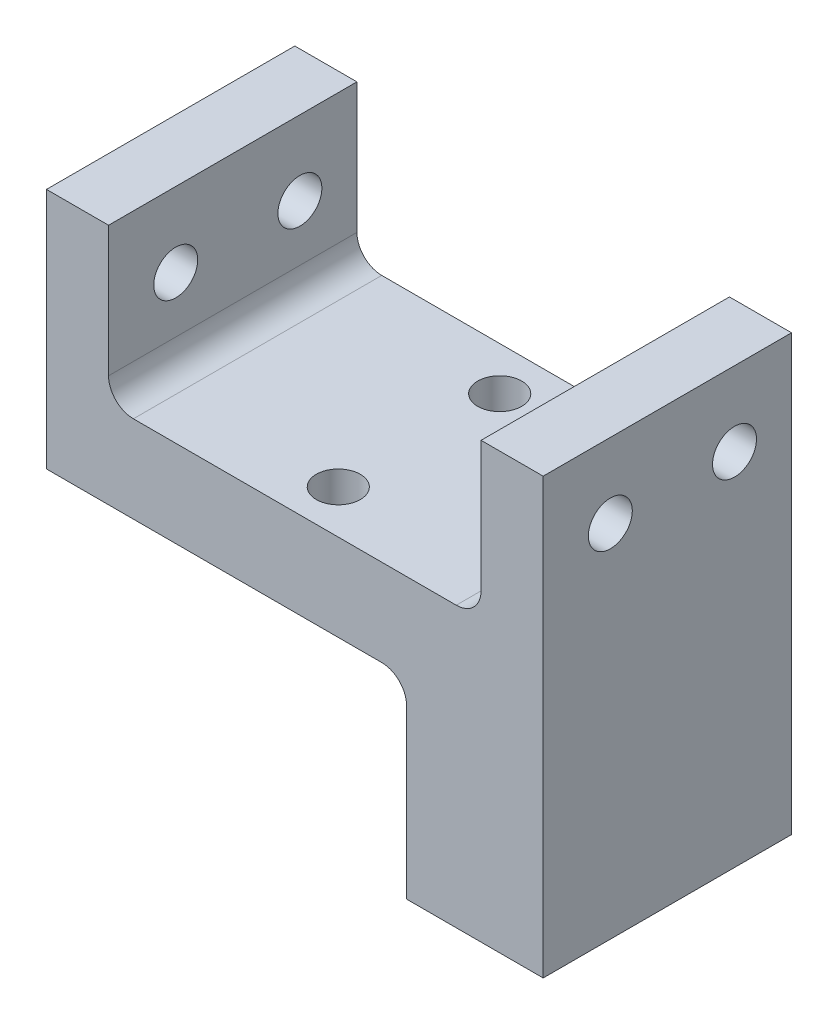
ISO-10303-21;
HEADER;
FILE_DESCRIPTION(('STEP AP214'),'2;1');
FILE_NAME('part.step','',(''),(''),'','','');
FILE_SCHEMA(('AUTOMOTIVE_DESIGN { 1 0 10303 214 1 1 1 1 }'));
ENDSEC;
DATA;
#1=APPLICATION_CONTEXT('core data for automotive mechanical design processes');
#2=APPLICATION_PROTOCOL_DEFINITION('international standard','automotive_design',2000,#1);
#3=PRODUCT_CONTEXT('',#1,'mechanical');
#4=PRODUCT('Part','Part','',(#3));
#5=PRODUCT_RELATED_PRODUCT_CATEGORY('part','',(#4));
#6=PRODUCT_DEFINITION_FORMATION('','',#4);
#7=PRODUCT_DEFINITION_CONTEXT('part definition',#1,'design');
#8=PRODUCT_DEFINITION('design','',#6,#7);
#9=PRODUCT_DEFINITION_SHAPE('','',#8);
#10=(LENGTH_UNIT() NAMED_UNIT(*) SI_UNIT(.MILLI.,.METRE.));
#11=(NAMED_UNIT(*) PLANE_ANGLE_UNIT() SI_UNIT($,.RADIAN.));
#12=(NAMED_UNIT(*) SI_UNIT($,.STERADIAN.) SOLID_ANGLE_UNIT());
#13=UNCERTAINTY_MEASURE_WITH_UNIT(LENGTH_MEASURE(1.E-05),#10,'distance_accuracy_value','');
#14=(GEOMETRIC_REPRESENTATION_CONTEXT(3) GLOBAL_UNCERTAINTY_ASSIGNED_CONTEXT((#13)) GLOBAL_UNIT_ASSIGNED_CONTEXT((#10,
#11,#12)) REPRESENTATION_CONTEXT('',''));
#15=CARTESIAN_POINT('',(0.,0.,0.));
#16=DIRECTION('',(0.,0.,1.));
#17=DIRECTION('',(1.,0.,0.));
#18=AXIS2_PLACEMENT_3D('',#15,#16,#17);
#19=CARTESIAN_POINT('',(-25.4,44.45,-12.7));
#20=DIRECTION('',(0.,0.,1.));
#21=DIRECTION('',(1.,0.,0.));
#22=AXIS2_PLACEMENT_3D('',#19,#20,#21);
#23=PLANE('',#22);
#24=CARTESIAN_POINT('',(-22.225,27.5085012840566,-12.7));
#25=DIRECTION('',(0.,0.,1.));
#26=DIRECTION('',(1.,0.,0.));
#27=AXIS2_PLACEMENT_3D('',#24,#25,#26);
#28=CIRCLE('',#27,1.27);
#29=CARTESIAN_POINT('',(-20.955,27.5085012840566,-12.7));
#30=VERTEX_POINT('',#29);
#31=EDGE_CURVE('E487',#30,#30,#28,.T.);
#32=ORIENTED_EDGE('',*,*,#31,.T.);
#33=EDGE_LOOP('',(#32));
#34=FACE_BOUND('',#33,.T.);
#35=CARTESIAN_POINT('',(22.225,27.5085012840566,-12.7));
#36=DIRECTION('',(0.,0.,1.));
#37=DIRECTION('',(1.,0.,0.));
#38=AXIS2_PLACEMENT_3D('',#35,#36,#37);
#39=CIRCLE('',#38,1.27);
#40=CARTESIAN_POINT('',(23.495,27.5085012840566,-12.7));
#41=VERTEX_POINT('',#40);
#42=EDGE_CURVE('E490',#41,#41,#39,.T.);
#43=ORIENTED_EDGE('',*,*,#42,.T.);
#44=EDGE_LOOP('',(#43));
#45=FACE_BOUND('',#44,.T.);
#46=DIRECTION('',(0.,1.,0.));
#47=VECTOR('',#46,1.);
#48=CARTESIAN_POINT('',(11.43,0.,-12.7));
#49=LINE('',#48,#47);
#50=CARTESIAN_POINT('',(11.43,0.,-12.7));
#51=VERTEX_POINT('',#50);
#52=CARTESIAN_POINT('',(11.43,17.145,-12.7));
#53=VERTEX_POINT('',#52);
#54=EDGE_CURVE('E203',#51,#53,#49,.T.);
#55=ORIENTED_EDGE('',*,*,#54,.T.);
#56=CARTESIAN_POINT('',(8.89,17.145,-12.7));
#57=DIRECTION('',(0.,0.,1.));
#58=DIRECTION('',(1.,0.,0.));
#59=AXIS2_PLACEMENT_3D('',#56,#57,#58);
#60=CIRCLE('',#59,2.54);
#61=CARTESIAN_POINT('',(8.89,19.685,-12.7));
#62=VERTEX_POINT('',#61);
#63=EDGE_CURVE('E323',#53,#62,#60,.T.);
#64=ORIENTED_EDGE('',*,*,#63,.T.);
#65=DIRECTION('',(-1.,0.,0.));
#66=VECTOR('',#65,1.);
#67=CARTESIAN_POINT('',(0.,19.685,-12.7));
#68=LINE('',#67,#66);
#69=CARTESIAN_POINT('',(-25.4,19.685,-12.7));
#70=VERTEX_POINT('',#69);
#71=EDGE_CURVE('E207',#62,#70,#68,.T.);
#72=ORIENTED_EDGE('',*,*,#71,.T.);
#73=DIRECTION('',(0.,-1.,0.));
#74=VECTOR('',#73,1.);
#75=CARTESIAN_POINT('',(-25.4,44.45,-12.7));
#76=LINE('',#75,#74);
#77=CARTESIAN_POINT('',(-25.4,44.45,-12.7));
#78=VERTEX_POINT('',#77);
#79=EDGE_CURVE('E286',#78,#70,#76,.T.);
#80=ORIENTED_EDGE('',*,*,#79,.F.);
#81=DIRECTION('',(-1.,0.,0.));
#82=VECTOR('',#81,1.);
#83=CARTESIAN_POINT('',(-25.4,44.45,-12.7));
#84=LINE('',#83,#82);
#85=CARTESIAN_POINT('',(-19.05,44.45,-12.7));
#86=VERTEX_POINT('',#85);
#87=EDGE_CURVE('E255',#86,#78,#84,.T.);
#88=ORIENTED_EDGE('',*,*,#87,.F.);
#89=DIRECTION('',(0.,1.,0.));
#90=VECTOR('',#89,1.);
#91=CARTESIAN_POINT('',(-19.05,0.,-12.7));
#92=LINE('',#91,#90);
#93=CARTESIAN_POINT('',(-19.05,31.115,-12.7));
#94=VERTEX_POINT('',#93);
#95=EDGE_CURVE('E233',#94,#86,#92,.T.);
#96=ORIENTED_EDGE('',*,*,#95,.F.);
#97=CARTESIAN_POINT('',(-16.51,31.115,-12.7));
#98=DIRECTION('',(0.,0.,1.));
#99=DIRECTION('',(1.,0.,0.));
#100=AXIS2_PLACEMENT_3D('',#97,#98,#99);
#101=CIRCLE('',#100,2.54);
#102=CARTESIAN_POINT('',(-16.51,28.575,-12.7));
#103=VERTEX_POINT('',#102);
#104=EDGE_CURVE('E329',#94,#103,#101,.T.);
#105=ORIENTED_EDGE('',*,*,#104,.T.);
#106=DIRECTION('',(1.,0.,0.));
#107=VECTOR('',#106,1.);
#108=CARTESIAN_POINT('',(0.,28.575,-12.7));
#109=LINE('',#108,#107);
#110=CARTESIAN_POINT('',(16.51,28.575,-12.7));
#111=VERTEX_POINT('',#110);
#112=EDGE_CURVE('E226',#103,#111,#109,.T.);
#113=ORIENTED_EDGE('',*,*,#112,.T.);
#114=CARTESIAN_POINT('',(16.51,31.115,-12.7));
#115=DIRECTION('',(0.,0.,1.));
#116=DIRECTION('',(1.,0.,0.));
#117=AXIS2_PLACEMENT_3D('',#114,#115,#116);
#118=CIRCLE('',#117,2.54);
#119=CARTESIAN_POINT('',(19.05,31.115,-12.7));
#120=VERTEX_POINT('',#119);
#121=EDGE_CURVE('E11',#111,#120,#118,.T.);
#122=ORIENTED_EDGE('',*,*,#121,.T.);
#123=DIRECTION('',(0.,1.,0.));
#124=VECTOR('',#123,1.);
#125=CARTESIAN_POINT('',(19.05,0.,-12.7));
#126=LINE('',#125,#124);
#127=CARTESIAN_POINT('',(19.05,44.45,-12.7));
#128=VERTEX_POINT('',#127);
#129=EDGE_CURVE('E229',#120,#128,#126,.T.);
#130=ORIENTED_EDGE('',*,*,#129,.T.);
#131=CARTESIAN_POINT('',(25.4,44.45,-12.7));
#132=VERTEX_POINT('',#131);
#133=EDGE_CURVE('E257',#132,#128,#84,.T.);
#134=ORIENTED_EDGE('',*,*,#133,.F.);
#135=DIRECTION('',(0.,-1.,0.));
#136=VECTOR('',#135,1.);
#137=CARTESIAN_POINT('',(25.4,44.45,-12.7));
#138=LINE('',#137,#136);
#139=CARTESIAN_POINT('',(25.4,0.,-12.7));
#140=VERTEX_POINT('',#139);
#141=EDGE_CURVE('E290',#132,#140,#138,.T.);
#142=ORIENTED_EDGE('',*,*,#141,.T.);
#143=DIRECTION('',(-1.,0.,0.));
#144=VECTOR('',#143,1.);
#145=CARTESIAN_POINT('',(-25.4,0.,-12.7));
#146=LINE('',#145,#144);
#147=EDGE_CURVE('E273',#140,#51,#146,.T.);
#148=ORIENTED_EDGE('',*,*,#147,.T.);
#149=EDGE_LOOP('',(#55,#64,#72,#80,#88,#96,#105,#113,#122,#130,#134,#142,#148));
#150=FACE_BOUND('',#149,.T.);
#151=ADVANCED_FACE('F45',(#34,#45,#150),#23,.F.);
#152=CARTESIAN_POINT('',(-25.4,44.45,12.7));
#153=DIRECTION('',(0.,0.,-1.));
#154=DIRECTION('',(-1.,0.,0.));
#155=AXIS2_PLACEMENT_3D('',#152,#153,#154);
#156=PLANE('',#155);
#157=DIRECTION('',(0.,-1.,0.));
#158=VECTOR('',#157,1.);
#159=CARTESIAN_POINT('',(-25.4,44.45,12.7));
#160=LINE('',#159,#158);
#161=CARTESIAN_POINT('',(-25.4,44.45,12.7));
#162=VERTEX_POINT('',#161);
#163=CARTESIAN_POINT('',(-25.4,19.685,12.7));
#164=VERTEX_POINT('',#163);
#165=EDGE_CURVE('E282',#162,#164,#160,.T.);
#166=ORIENTED_EDGE('',*,*,#165,.T.);
#167=DIRECTION('',(-1.,0.,0.));
#168=VECTOR('',#167,1.);
#169=CARTESIAN_POINT('',(0.,19.685,12.7));
#170=LINE('',#169,#168);
#171=CARTESIAN_POINT('',(8.89,19.685,12.7));
#172=VERTEX_POINT('',#171);
#173=EDGE_CURVE('E208',#172,#164,#170,.T.);
#174=ORIENTED_EDGE('',*,*,#173,.F.);
#175=CARTESIAN_POINT('',(8.89,17.145,12.7));
#176=DIRECTION('',(0.,0.,-1.));
#177=DIRECTION('',(-1.,0.,0.));
#178=AXIS2_PLACEMENT_3D('',#175,#176,#177);
#179=CIRCLE('',#178,2.54);
#180=CARTESIAN_POINT('',(11.43,17.145,12.7));
#181=VERTEX_POINT('',#180);
#182=EDGE_CURVE('E320',#172,#181,#179,.T.);
#183=ORIENTED_EDGE('',*,*,#182,.T.);
#184=DIRECTION('',(0.,1.,0.));
#185=VECTOR('',#184,1.);
#186=CARTESIAN_POINT('',(11.43,0.,12.7));
#187=LINE('',#186,#185);
#188=CARTESIAN_POINT('',(11.43,0.,12.7));
#189=VERTEX_POINT('',#188);
#190=EDGE_CURVE('E212',#189,#181,#187,.T.);
#191=ORIENTED_EDGE('',*,*,#190,.F.);
#192=DIRECTION('',(1.,0.,0.));
#193=VECTOR('',#192,1.);
#194=CARTESIAN_POINT('',(-25.4,0.,12.7));
#195=LINE('',#194,#193);
#196=CARTESIAN_POINT('',(25.4,0.,12.7));
#197=VERTEX_POINT('',#196);
#198=EDGE_CURVE('E256',#189,#197,#195,.T.);
#199=ORIENTED_EDGE('',*,*,#198,.T.);
#200=DIRECTION('',(0.,-1.,0.));
#201=VECTOR('',#200,1.);
#202=CARTESIAN_POINT('',(25.4,44.45,12.7));
#203=LINE('',#202,#201);
#204=CARTESIAN_POINT('',(25.4,44.45,12.7));
#205=VERTEX_POINT('',#204);
#206=EDGE_CURVE('E269',#205,#197,#203,.T.);
#207=ORIENTED_EDGE('',*,*,#206,.F.);
#208=DIRECTION('',(1.,0.,0.));
#209=VECTOR('',#208,1.);
#210=CARTESIAN_POINT('',(-25.4,44.45,12.7));
#211=LINE('',#210,#209);
#212=CARTESIAN_POINT('',(19.05,44.45,12.7));
#213=VERTEX_POINT('',#212);
#214=EDGE_CURVE('E264',#213,#205,#211,.T.);
#215=ORIENTED_EDGE('',*,*,#214,.F.);
#216=DIRECTION('',(0.,1.,0.));
#217=VECTOR('',#216,1.);
#218=CARTESIAN_POINT('',(19.05,0.,12.7));
#219=LINE('',#218,#217);
#220=CARTESIAN_POINT('',(19.05,31.115,12.7));
#221=VERTEX_POINT('',#220);
#222=EDGE_CURVE('E240',#221,#213,#219,.T.);
#223=ORIENTED_EDGE('',*,*,#222,.F.);
#224=CARTESIAN_POINT('',(16.51,31.115,12.7));
#225=DIRECTION('',(0.,0.,-1.));
#226=DIRECTION('',(-1.,0.,0.));
#227=AXIS2_PLACEMENT_3D('',#224,#225,#226);
#228=CIRCLE('',#227,2.54);
#229=CARTESIAN_POINT('',(16.51,28.575,12.7));
#230=VERTEX_POINT('',#229);
#231=EDGE_CURVE('E54',#221,#230,#228,.T.);
#232=ORIENTED_EDGE('',*,*,#231,.T.);
#233=DIRECTION('',(1.,0.,0.));
#234=VECTOR('',#233,1.);
#235=CARTESIAN_POINT('',(0.,28.575,12.7));
#236=LINE('',#235,#234);
#237=CARTESIAN_POINT('',(-16.51,28.575,12.7));
#238=VERTEX_POINT('',#237);
#239=EDGE_CURVE('E202',#238,#230,#236,.T.);
#240=ORIENTED_EDGE('',*,*,#239,.F.);
#241=CARTESIAN_POINT('',(-16.51,31.115,12.7));
#242=DIRECTION('',(0.,0.,-1.));
#243=DIRECTION('',(-1.,0.,0.));
#244=AXIS2_PLACEMENT_3D('',#241,#242,#243);
#245=CIRCLE('',#244,2.54);
#246=CARTESIAN_POINT('',(-19.05,31.115,12.7));
#247=VERTEX_POINT('',#246);
#248=EDGE_CURVE('E326',#238,#247,#245,.T.);
#249=ORIENTED_EDGE('',*,*,#248,.T.);
#250=DIRECTION('',(0.,1.,0.));
#251=VECTOR('',#250,1.);
#252=CARTESIAN_POINT('',(-19.05,0.,12.7));
#253=LINE('',#252,#251);
#254=CARTESIAN_POINT('',(-19.05,44.45,12.7));
#255=VERTEX_POINT('',#254);
#256=EDGE_CURVE('E230',#247,#255,#253,.T.);
#257=ORIENTED_EDGE('',*,*,#256,.T.);
#258=EDGE_CURVE('E265',#162,#255,#211,.T.);
#259=ORIENTED_EDGE('',*,*,#258,.F.);
#260=EDGE_LOOP('',(#166,#174,#183,#191,#199,#207,#215,#223,#232,#240,#249,#257,#259));
#261=FACE_BOUND('',#260,.T.);
#262=ADVANCED_FACE('F335',(#261),#156,.F.);
#263=CARTESIAN_POINT('',(0.,44.45,0.));
#264=DIRECTION('',(0.,-1.,0.));
#265=DIRECTION('',(0.,0.,-1.));
#266=AXIS2_PLACEMENT_3D('',#263,#264,#265);
#267=PLANE('',#266);
#268=DIRECTION('',(0.,0.,1.));
#269=VECTOR('',#268,1.);
#270=CARTESIAN_POINT('',(-19.05,44.45,-12.7));
#271=LINE('',#270,#269);
#272=EDGE_CURVE('E216',#86,#255,#271,.T.);
#273=ORIENTED_EDGE('',*,*,#272,.F.);
#274=ORIENTED_EDGE('',*,*,#87,.T.);
#275=DIRECTION('',(0.,0.,1.));
#276=VECTOR('',#275,1.);
#277=CARTESIAN_POINT('',(-25.4,44.45,12.7));
#278=LINE('',#277,#276);
#279=EDGE_CURVE('E261',#78,#162,#278,.T.);
#280=ORIENTED_EDGE('',*,*,#279,.T.);
#281=ORIENTED_EDGE('',*,*,#258,.T.);
#282=EDGE_LOOP('',(#273,#274,#280,#281));
#283=FACE_BOUND('',#282,.T.);
#284=ADVANCED_FACE('F381',(#283),#267,.F.);
#285=CARTESIAN_POINT('',(25.4,44.45,12.7));
#286=DIRECTION('',(-1.,0.,0.));
#287=DIRECTION('',(0.,0.,1.));
#288=AXIS2_PLACEMENT_3D('',#285,#286,#287);
#289=PLANE('',#288);
#290=CARTESIAN_POINT('',(25.4,36.83,-6.86818594327573));
#291=DIRECTION('',(1.,0.,0.));
#292=DIRECTION('',(0.,0.,-1.));
#293=AXIS2_PLACEMENT_3D('',#290,#291,#292);
#294=CIRCLE('',#293,2.24789999999999);
#295=CARTESIAN_POINT('',(25.4,36.83,-9.11608594327572));
#296=VERTEX_POINT('',#295);
#297=EDGE_CURVE('E173',#296,#296,#294,.T.);
#298=ORIENTED_EDGE('',*,*,#297,.F.);
#299=EDGE_LOOP('',(#298));
#300=FACE_BOUND('',#299,.T.);
#301=CARTESIAN_POINT('',(25.4,36.83,5.83181405672426));
#302=DIRECTION('',(1.,0.,0.));
#303=DIRECTION('',(0.,0.,-1.));
#304=AXIS2_PLACEMENT_3D('',#301,#302,#303);
#305=CIRCLE('',#304,2.24789999999999);
#306=CARTESIAN_POINT('',(25.4,36.83,3.58391405672428));
#307=VERTEX_POINT('',#306);
#308=EDGE_CURVE('E186',#307,#307,#305,.T.);
#309=ORIENTED_EDGE('',*,*,#308,.F.);
#310=EDGE_LOOP('',(#309));
#311=FACE_BOUND('',#310,.T.);
#312=DIRECTION('',(0.,0.,-1.));
#313=VECTOR('',#312,1.);
#314=CARTESIAN_POINT('',(25.4,0.,12.7));
#315=LINE('',#314,#313);
#316=EDGE_CURVE('E223',#197,#140,#315,.T.);
#317=ORIENTED_EDGE('',*,*,#316,.T.);
#318=ORIENTED_EDGE('',*,*,#141,.F.);
#319=DIRECTION('',(0.,0.,-1.));
#320=VECTOR('',#319,1.);
#321=CARTESIAN_POINT('',(25.4,44.45,12.7));
#322=LINE('',#321,#320);
#323=EDGE_CURVE('E251',#205,#132,#322,.T.);
#324=ORIENTED_EDGE('',*,*,#323,.F.);
#325=ORIENTED_EDGE('',*,*,#206,.T.);
#326=EDGE_LOOP('',(#317,#318,#324,#325));
#327=FACE_BOUND('',#326,.T.);
#328=ADVANCED_FACE('F350',(#300,#311,#327),#289,.F.);
#329=CARTESIAN_POINT('',(-25.4,44.45,12.7));
#330=DIRECTION('',(1.,0.,0.));
#331=DIRECTION('',(0.,0.,-1.));
#332=AXIS2_PLACEMENT_3D('',#329,#330,#331);
#333=PLANE('',#332);
#334=CARTESIAN_POINT('',(-25.4,36.83,-6.86818594327573));
#335=DIRECTION('',(1.,0.,0.));
#336=DIRECTION('',(0.,0.,-1.));
#337=AXIS2_PLACEMENT_3D('',#334,#335,#336);
#338=CIRCLE('',#337,2.24789999999999);
#339=CARTESIAN_POINT('',(-25.4,36.83,-9.11608594327572));
#340=VERTEX_POINT('',#339);
#341=EDGE_CURVE('E177',#340,#340,#338,.T.);
#342=ORIENTED_EDGE('',*,*,#341,.T.);
#343=EDGE_LOOP('',(#342));
#344=FACE_BOUND('',#343,.T.);
#345=CARTESIAN_POINT('',(-25.4,36.83,5.83181405672426));
#346=DIRECTION('',(1.,0.,0.));
#347=DIRECTION('',(0.,0.,-1.));
#348=AXIS2_PLACEMENT_3D('',#345,#346,#347);
#349=CIRCLE('',#348,2.24789999999999);
#350=CARTESIAN_POINT('',(-25.4,36.83,3.58391405672428));
#351=VERTEX_POINT('',#350);
#352=EDGE_CURVE('E190',#351,#351,#349,.T.);
#353=ORIENTED_EDGE('',*,*,#352,.T.);
#354=EDGE_LOOP('',(#353));
#355=FACE_BOUND('',#354,.T.);
#356=ORIENTED_EDGE('',*,*,#79,.T.);
#357=DIRECTION('',(0.,0.,1.));
#358=VECTOR('',#357,1.);
#359=CARTESIAN_POINT('',(-25.4,19.685,-12.7));
#360=LINE('',#359,#358);
#361=EDGE_CURVE('E219',#70,#164,#360,.T.);
#362=ORIENTED_EDGE('',*,*,#361,.T.);
#363=ORIENTED_EDGE('',*,*,#165,.F.);
#364=ORIENTED_EDGE('',*,*,#279,.F.);
#365=EDGE_LOOP('',(#356,#362,#363,#364));
#366=FACE_BOUND('',#365,.T.);
#367=ADVANCED_FACE('F372',(#344,#355,#366),#333,.F.);
#368=ORIENTED_EDGE('',*,*,#133,.T.);
#369=DIRECTION('',(0.,0.,1.));
#370=VECTOR('',#369,1.);
#371=CARTESIAN_POINT('',(19.05,44.45,-12.7));
#372=LINE('',#371,#370);
#373=EDGE_CURVE('E236',#128,#213,#372,.T.);
#374=ORIENTED_EDGE('',*,*,#373,.T.);
#375=ORIENTED_EDGE('',*,*,#214,.T.);
#376=ORIENTED_EDGE('',*,*,#323,.T.);
#377=EDGE_LOOP('',(#368,#374,#375,#376));
#378=FACE_BOUND('',#377,.T.);
#379=ADVANCED_FACE('F347',(#378),#267,.F.);
#380=CARTESIAN_POINT('',(0.,0.,0.));
#381=DIRECTION('',(0.,-1.,0.));
#382=DIRECTION('',(0.,0.,-1.));
#383=AXIS2_PLACEMENT_3D('',#380,#381,#382);
#384=PLANE('',#383);
#385=DIRECTION('',(0.,0.,1.));
#386=VECTOR('',#385,1.);
#387=CARTESIAN_POINT('',(11.43,0.,-12.7));
#388=LINE('',#387,#386);
#389=EDGE_CURVE('E211',#51,#189,#388,.T.);
#390=ORIENTED_EDGE('',*,*,#389,.F.);
#391=ORIENTED_EDGE('',*,*,#147,.F.);
#392=ORIENTED_EDGE('',*,*,#316,.F.);
#393=ORIENTED_EDGE('',*,*,#198,.F.);
#394=EDGE_LOOP('',(#390,#391,#392,#393));
#395=FACE_BOUND('',#394,.T.);
#396=ADVANCED_FACE('F355',(#395),#384,.T.);
#397=CARTESIAN_POINT('',(0.,19.685,-12.7));
#398=DIRECTION('',(0.,1.,0.));
#399=DIRECTION('',(-1.,0.,0.));
#400=AXIS2_PLACEMENT_3D('',#397,#398,#399);
#401=PLANE('',#400);
#402=CARTESIAN_POINT('',(0.,19.685,-8.255));
#403=DIRECTION('',(0.,1.,0.));
#404=DIRECTION('',(-1.,0.,0.));
#405=AXIS2_PLACEMENT_3D('',#402,#403,#404);
#406=CIRCLE('',#405,2.24789999999999);
#407=CARTESIAN_POINT('',(-2.24789999999999,19.685,-8.255));
#408=VERTEX_POINT('',#407);
#409=EDGE_CURVE('E158',#408,#408,#406,.T.);
#410=ORIENTED_EDGE('',*,*,#409,.T.);
#411=EDGE_LOOP('',(#410));
#412=FACE_BOUND('',#411,.T.);
#413=CARTESIAN_POINT('',(0.,19.685,8.255));
#414=DIRECTION('',(0.,1.,0.));
#415=DIRECTION('',(-1.,0.,0.));
#416=AXIS2_PLACEMENT_3D('',#413,#414,#415);
#417=CIRCLE('',#416,2.24789999999999);
#418=CARTESIAN_POINT('',(-2.24789999999999,19.685,8.255));
#419=VERTEX_POINT('',#418);
#420=EDGE_CURVE('E169',#419,#419,#417,.T.);
#421=ORIENTED_EDGE('',*,*,#420,.T.);
#422=EDGE_LOOP('',(#421));
#423=FACE_BOUND('',#422,.T.);
#424=ORIENTED_EDGE('',*,*,#71,.F.);
#425=DIRECTION('',(0.,0.,1.));
#426=VECTOR('',#425,1.);
#427=CARTESIAN_POINT('',(8.89,19.685,12.7));
#428=LINE('',#427,#426);
#429=EDGE_CURVE('E294',#62,#172,#428,.T.);
#430=ORIENTED_EDGE('',*,*,#429,.T.);
#431=ORIENTED_EDGE('',*,*,#173,.T.);
#432=ORIENTED_EDGE('',*,*,#361,.F.);
#433=EDGE_LOOP('',(#424,#430,#431,#432));
#434=FACE_BOUND('',#433,.T.);
#435=ADVANCED_FACE('F365',(#412,#423,#434),#401,.F.);
#436=CARTESIAN_POINT('',(11.43,0.,-12.7));
#437=DIRECTION('',(1.,0.,0.));
#438=DIRECTION('',(0.,1.,0.));
#439=AXIS2_PLACEMENT_3D('',#436,#437,#438);
#440=PLANE('',#439);
#441=CARTESIAN_POINT('',(11.43,6.09600000000001,2.91627603880779));
#442=DIRECTION('',(-1.,0.,0.));
#443=DIRECTION('',(0.,0.,1.));
#444=AXIS2_PLACEMENT_3D('',#441,#442,#443);
#445=CIRCLE('',#444,2.28599999999999);
#446=CARTESIAN_POINT('',(11.43,6.09600000000001,5.20227603880777));
#447=VERTEX_POINT('',#446);
#448=EDGE_CURVE('E153',#447,#447,#445,.T.);
#449=ORIENTED_EDGE('',*,*,#448,.F.);
#450=EDGE_LOOP('',(#449));
#451=FACE_BOUND('',#450,.T.);
#452=ORIENTED_EDGE('',*,*,#190,.T.);
#453=DIRECTION('',(0.,0.,1.));
#454=VECTOR('',#453,1.);
#455=CARTESIAN_POINT('',(11.43,17.145,-12.7));
#456=LINE('',#455,#454);
#457=EDGE_CURVE('E304',#181,#53,#456,.F.);
#458=ORIENTED_EDGE('',*,*,#457,.T.);
#459=ORIENTED_EDGE('',*,*,#54,.F.);
#460=ORIENTED_EDGE('',*,*,#389,.T.);
#461=EDGE_LOOP('',(#452,#458,#459,#460));
#462=FACE_BOUND('',#461,.T.);
#463=ADVANCED_FACE('F441',(#451,#462),#440,.F.);
#464=CARTESIAN_POINT('',(0.,28.575,-12.7));
#465=DIRECTION('',(0.,-1.,0.));
#466=DIRECTION('',(0.,0.,-1.));
#467=AXIS2_PLACEMENT_3D('',#464,#465,#466);
#468=PLANE('',#467);
#469=CARTESIAN_POINT('',(0.,28.575,-8.255));
#470=DIRECTION('',(0.,1.,0.));
#471=DIRECTION('',(0.,0.,1.));
#472=AXIS2_PLACEMENT_3D('',#469,#470,#471);
#473=CIRCLE('',#472,2.24789999999999);
#474=CARTESIAN_POINT('',(0.,28.575,-6.00710000000001));
#475=VERTEX_POINT('',#474);
#476=EDGE_CURVE('E152',#475,#475,#473,.T.);
#477=ORIENTED_EDGE('',*,*,#476,.F.);
#478=EDGE_LOOP('',(#477));
#479=FACE_BOUND('',#478,.T.);
#480=CARTESIAN_POINT('',(0.,28.575,8.255));
#481=DIRECTION('',(0.,1.,0.));
#482=DIRECTION('',(0.,0.,1.));
#483=AXIS2_PLACEMENT_3D('',#480,#481,#482);
#484=CIRCLE('',#483,2.24789999999999);
#485=CARTESIAN_POINT('',(0.,28.575,10.5029));
#486=VERTEX_POINT('',#485);
#487=EDGE_CURVE('E165',#486,#486,#484,.T.);
#488=ORIENTED_EDGE('',*,*,#487,.F.);
#489=EDGE_LOOP('',(#488));
#490=FACE_BOUND('',#489,.T.);
#491=ORIENTED_EDGE('',*,*,#112,.F.);
#492=DIRECTION('',(0.,0.,1.));
#493=VECTOR('',#492,1.);
#494=CARTESIAN_POINT('',(-16.51,28.575,-12.7));
#495=LINE('',#494,#493);
#496=EDGE_CURVE('E310',#103,#238,#495,.T.);
#497=ORIENTED_EDGE('',*,*,#496,.T.);
#498=ORIENTED_EDGE('',*,*,#239,.T.);
#499=DIRECTION('',(0.,0.,1.));
#500=VECTOR('',#499,1.);
#501=CARTESIAN_POINT('',(16.51,28.575,-12.7));
#502=LINE('',#501,#500);
#503=EDGE_CURVE('E307',#230,#111,#502,.F.);
#504=ORIENTED_EDGE('',*,*,#503,.T.);
#505=EDGE_LOOP('',(#491,#497,#498,#504));
#506=FACE_BOUND('',#505,.T.);
#507=ADVANCED_FACE('F339',(#479,#490,#506),#468,.F.);
#508=CARTESIAN_POINT('',(-19.05,0.,-12.7));
#509=DIRECTION('',(1.,0.,0.));
#510=DIRECTION('',(0.,0.,-1.));
#511=AXIS2_PLACEMENT_3D('',#508,#509,#510);
#512=PLANE('',#511);
#513=CARTESIAN_POINT('',(-19.05,36.83,-6.86818594327573));
#514=DIRECTION('',(1.,0.,0.));
#515=DIRECTION('',(0.,0.,-1.));
#516=AXIS2_PLACEMENT_3D('',#513,#514,#515);
#517=CIRCLE('',#516,2.24789999999999);
#518=CARTESIAN_POINT('',(-19.05,36.83,-9.11608594327572));
#519=VERTEX_POINT('',#518);
#520=EDGE_CURVE('E182',#519,#519,#517,.T.);
#521=ORIENTED_EDGE('',*,*,#520,.F.);
#522=EDGE_LOOP('',(#521));
#523=FACE_BOUND('',#522,.T.);
#524=CARTESIAN_POINT('',(-19.05,36.83,5.83181405672426));
#525=DIRECTION('',(1.,0.,0.));
#526=DIRECTION('',(0.,0.,-1.));
#527=AXIS2_PLACEMENT_3D('',#524,#525,#526);
#528=CIRCLE('',#527,2.24789999999999);
#529=CARTESIAN_POINT('',(-19.05,36.83,3.58391405672428));
#530=VERTEX_POINT('',#529);
#531=EDGE_CURVE('E194',#530,#530,#528,.T.);
#532=ORIENTED_EDGE('',*,*,#531,.F.);
#533=EDGE_LOOP('',(#532));
#534=FACE_BOUND('',#533,.T.);
#535=ORIENTED_EDGE('',*,*,#256,.F.);
#536=DIRECTION('',(0.,0.,1.));
#537=VECTOR('',#536,1.);
#538=CARTESIAN_POINT('',(-19.05,31.115,-12.7));
#539=LINE('',#538,#537);
#540=EDGE_CURVE('E314',#247,#94,#539,.F.);
#541=ORIENTED_EDGE('',*,*,#540,.T.);
#542=ORIENTED_EDGE('',*,*,#95,.T.);
#543=ORIENTED_EDGE('',*,*,#272,.T.);
#544=EDGE_LOOP('',(#535,#541,#542,#543));
#545=FACE_BOUND('',#544,.T.);
#546=ADVANCED_FACE('F384',(#523,#534,#545),#512,.T.);
#547=CARTESIAN_POINT('',(19.05,0.,-12.7));
#548=DIRECTION('',(1.,0.,0.));
#549=DIRECTION('',(0.,0.,-1.));
#550=AXIS2_PLACEMENT_3D('',#547,#548,#549);
#551=PLANE('',#550);
#552=CARTESIAN_POINT('',(19.05,36.83,-6.86818594327573));
#553=DIRECTION('',(1.,0.,0.));
#554=DIRECTION('',(0.,0.,-1.));
#555=AXIS2_PLACEMENT_3D('',#552,#553,#554);
#556=CIRCLE('',#555,2.24789999999999);
#557=CARTESIAN_POINT('',(19.05,36.83,-9.11608594327572));
#558=VERTEX_POINT('',#557);
#559=EDGE_CURVE('E181',#558,#558,#556,.T.);
#560=ORIENTED_EDGE('',*,*,#559,.T.);
#561=EDGE_LOOP('',(#560));
#562=FACE_BOUND('',#561,.T.);
#563=CARTESIAN_POINT('',(19.05,36.83,5.83181405672426));
#564=DIRECTION('',(1.,0.,0.));
#565=DIRECTION('',(0.,0.,-1.));
#566=AXIS2_PLACEMENT_3D('',#563,#564,#565);
#567=CIRCLE('',#566,2.24789999999999);
#568=CARTESIAN_POINT('',(19.05,36.83,3.58391405672428));
#569=VERTEX_POINT('',#568);
#570=EDGE_CURVE('E198',#569,#569,#567,.T.);
#571=ORIENTED_EDGE('',*,*,#570,.T.);
#572=EDGE_LOOP('',(#571));
#573=FACE_BOUND('',#572,.T.);
#574=ORIENTED_EDGE('',*,*,#129,.F.);
#575=DIRECTION('',(0.,0.,1.));
#576=VECTOR('',#575,1.);
#577=CARTESIAN_POINT('',(19.05,31.115,12.7));
#578=LINE('',#577,#576);
#579=EDGE_CURVE('E317',#120,#221,#578,.T.);
#580=ORIENTED_EDGE('',*,*,#579,.T.);
#581=ORIENTED_EDGE('',*,*,#222,.T.);
#582=ORIENTED_EDGE('',*,*,#373,.F.);
#583=EDGE_LOOP('',(#574,#580,#581,#582));
#584=FACE_BOUND('',#583,.T.);
#585=ADVANCED_FACE('F342',(#562,#573,#584),#551,.F.);
#586=CARTESIAN_POINT('',(25.4,36.83,5.83181405672426));
#587=DIRECTION('',(1.,0.,0.));
#588=DIRECTION('',(0.,0.,-1.));
#589=AXIS2_PLACEMENT_3D('',#586,#587,#588);
#590=CYLINDRICAL_SURFACE('',#589,2.24789999999999);
#591=ORIENTED_EDGE('',*,*,#531,.T.);
#592=EDGE_LOOP('',(#591));
#593=FACE_BOUND('',#592,.T.);
#594=ORIENTED_EDGE('',*,*,#352,.F.);
#595=EDGE_LOOP('',(#594));
#596=FACE_BOUND('',#595,.T.);
#597=ADVANCED_FACE('F424',(#593,#596),#590,.F.);
#598=ORIENTED_EDGE('',*,*,#308,.T.);
#599=EDGE_LOOP('',(#598));
#600=FACE_BOUND('',#599,.T.);
#601=ORIENTED_EDGE('',*,*,#570,.F.);
#602=EDGE_LOOP('',(#601));
#603=FACE_BOUND('',#602,.T.);
#604=ADVANCED_FACE('F420',(#600,#603),#590,.F.);
#605=CARTESIAN_POINT('',(25.4,36.83,-6.86818594327573));
#606=DIRECTION('',(1.,0.,0.));
#607=DIRECTION('',(0.,0.,-1.));
#608=AXIS2_PLACEMENT_3D('',#605,#606,#607);
#609=CYLINDRICAL_SURFACE('',#608,2.24789999999999);
#610=ORIENTED_EDGE('',*,*,#297,.T.);
#611=EDGE_LOOP('',(#610));
#612=FACE_BOUND('',#611,.T.);
#613=ORIENTED_EDGE('',*,*,#559,.F.);
#614=EDGE_LOOP('',(#613));
#615=FACE_BOUND('',#614,.T.);
#616=ADVANCED_FACE('F423',(#612,#615),#609,.F.);
#617=ORIENTED_EDGE('',*,*,#520,.T.);
#618=EDGE_LOOP('',(#617));
#619=FACE_BOUND('',#618,.T.);
#620=ORIENTED_EDGE('',*,*,#341,.F.);
#621=EDGE_LOOP('',(#620));
#622=FACE_BOUND('',#621,.T.);
#623=ADVANCED_FACE('F456',(#619,#622),#609,.F.);
#624=CARTESIAN_POINT('',(0.,28.575,8.255));
#625=DIRECTION('',(0.,1.,0.));
#626=DIRECTION('',(0.,0.,1.));
#627=AXIS2_PLACEMENT_3D('',#624,#625,#626);
#628=CYLINDRICAL_SURFACE('',#627,2.24789999999999);
#629=ORIENTED_EDGE('',*,*,#487,.T.);
#630=EDGE_LOOP('',(#629));
#631=FACE_BOUND('',#630,.T.);
#632=ORIENTED_EDGE('',*,*,#420,.F.);
#633=EDGE_LOOP('',(#632));
#634=FACE_BOUND('',#633,.T.);
#635=ADVANCED_FACE('F459',(#631,#634),#628,.F.);
#636=CARTESIAN_POINT('',(0.,28.575,-8.255));
#637=DIRECTION('',(0.,1.,0.));
#638=DIRECTION('',(0.,0.,1.));
#639=AXIS2_PLACEMENT_3D('',#636,#637,#638);
#640=CYLINDRICAL_SURFACE('',#639,2.24789999999999);
#641=ORIENTED_EDGE('',*,*,#476,.T.);
#642=EDGE_LOOP('',(#641));
#643=FACE_BOUND('',#642,.T.);
#644=ORIENTED_EDGE('',*,*,#409,.F.);
#645=EDGE_LOOP('',(#644));
#646=FACE_BOUND('',#645,.T.);
#647=ADVANCED_FACE('F145',(#643,#646),#640,.F.);
#648=CARTESIAN_POINT('',(19.05,6.09600000000001,2.91627603880779));
#649=DIRECTION('',(-1.,0.,0.));
#650=DIRECTION('',(0.,0.,1.));
#651=AXIS2_PLACEMENT_3D('',#648,#649,#650);
#652=CONICAL_SURFACE('',#651,2.286,1.02974425867665);
#653=CARTESIAN_POINT('',(20.423567375097,6.096,2.91627603880779));
#654=VERTEX_POINT('',#653);
#655=VERTEX_LOOP('',#654);
#656=FACE_BOUND('',#655,.T.);
#657=CARTESIAN_POINT('',(19.05,6.09600000000001,2.91627603880779));
#658=DIRECTION('',(-1.,0.,0.));
#659=DIRECTION('',(0.,0.,1.));
#660=AXIS2_PLACEMENT_3D('',#657,#658,#659);
#661=CIRCLE('',#660,2.286);
#662=CARTESIAN_POINT('',(19.05,6.09600000000001,5.20227603880778));
#663=VERTEX_POINT('',#662);
#664=EDGE_CURVE('E149',#663,#663,#661,.T.);
#665=ORIENTED_EDGE('',*,*,#664,.T.);
#666=EDGE_LOOP('',(#665));
#667=FACE_BOUND('',#666,.T.);
#668=ADVANCED_FACE('F141',(#656,#667),#652,.F.);
#669=CARTESIAN_POINT('',(11.43,6.09600000000001,2.91627603880779));
#670=DIRECTION('',(-1.,0.,0.));
#671=DIRECTION('',(0.,0.,1.));
#672=AXIS2_PLACEMENT_3D('',#669,#670,#671);
#673=CYLINDRICAL_SURFACE('',#672,2.28599999999999);
#674=ORIENTED_EDGE('',*,*,#664,.F.);
#675=EDGE_LOOP('',(#674));
#676=FACE_BOUND('',#675,.T.);
#677=ORIENTED_EDGE('',*,*,#448,.T.);
#678=EDGE_LOOP('',(#677));
#679=FACE_BOUND('',#678,.T.);
#680=ADVANCED_FACE('F144',(#676,#679),#673,.F.);
#681=CARTESIAN_POINT('',(8.89,17.145,-12.7));
#682=DIRECTION('',(0.,0.,-1.));
#683=DIRECTION('',(-1.,0.,0.));
#684=AXIS2_PLACEMENT_3D('',#681,#682,#683);
#685=CYLINDRICAL_SURFACE('',#684,2.54);
#686=ORIENTED_EDGE('',*,*,#63,.F.);
#687=ORIENTED_EDGE('',*,*,#457,.F.);
#688=ORIENTED_EDGE('',*,*,#182,.F.);
#689=ORIENTED_EDGE('',*,*,#429,.F.);
#690=EDGE_LOOP('',(#686,#687,#688,#689));
#691=FACE_BOUND('',#690,.T.);
#692=ADVANCED_FACE('F362',(#691),#685,.F.);
#693=CARTESIAN_POINT('',(-16.51,31.115,-12.7));
#694=DIRECTION('',(0.,0.,1.));
#695=DIRECTION('',(1.,0.,0.));
#696=AXIS2_PLACEMENT_3D('',#693,#694,#695);
#697=CYLINDRICAL_SURFACE('',#696,2.54);
#698=ORIENTED_EDGE('',*,*,#104,.F.);
#699=ORIENTED_EDGE('',*,*,#540,.F.);
#700=ORIENTED_EDGE('',*,*,#248,.F.);
#701=ORIENTED_EDGE('',*,*,#496,.F.);
#702=EDGE_LOOP('',(#698,#699,#700,#701));
#703=FACE_BOUND('',#702,.T.);
#704=ADVANCED_FACE('F387',(#703),#697,.F.);
#705=CARTESIAN_POINT('',(16.51,31.115,-12.7));
#706=DIRECTION('',(0.,0.,-1.));
#707=DIRECTION('',(-1.,0.,0.));
#708=AXIS2_PLACEMENT_3D('',#705,#706,#707);
#709=CYLINDRICAL_SURFACE('',#708,2.54);
#710=ORIENTED_EDGE('',*,*,#121,.F.);
#711=ORIENTED_EDGE('',*,*,#503,.F.);
#712=ORIENTED_EDGE('',*,*,#231,.F.);
#713=ORIENTED_EDGE('',*,*,#579,.F.);
#714=EDGE_LOOP('',(#710,#711,#712,#713));
#715=FACE_BOUND('',#714,.T.);
#716=ADVANCED_FACE('F47',(#715),#709,.F.);
#717=CARTESIAN_POINT('',(22.225,27.5085012840566,0.));
#718=DIRECTION('',(0.,0.,-1.));
#719=DIRECTION('',(-1.,0.,0.));
#720=AXIS2_PLACEMENT_3D('',#717,#718,#719);
#721=CYLINDRICAL_SURFACE('',#720,1.27);
#722=CARTESIAN_POINT('',(22.225,27.5085012840566,0.));
#723=DIRECTION('',(0.,0.,1.));
#724=DIRECTION('',(1.,0.,0.));
#725=AXIS2_PLACEMENT_3D('',#722,#723,#724);
#726=CIRCLE('',#725,1.27);
#727=CARTESIAN_POINT('',(23.495,27.5085012840566,0.));
#728=VERTEX_POINT('',#727);
#729=EDGE_CURVE('E495',#728,#728,#726,.T.);
#730=ORIENTED_EDGE('',*,*,#729,.T.);
#731=EDGE_LOOP('',(#730));
#732=FACE_BOUND('',#731,.T.);
#733=ORIENTED_EDGE('',*,*,#42,.F.);
#734=EDGE_LOOP('',(#733));
#735=FACE_BOUND('',#734,.T.);
#736=ADVANCED_FACE('F393',(#732,#735),#721,.F.);
#737=CARTESIAN_POINT('',(22.225,27.5085012840566,0.));
#738=DIRECTION('',(0.,0.,1.));
#739=DIRECTION('',(1.,0.,0.));
#740=AXIS2_PLACEMENT_3D('',#737,#738,#739);
#741=PLANE('',#740);
#742=ORIENTED_EDGE('',*,*,#729,.F.);
#743=EDGE_LOOP('',(#742));
#744=FACE_BOUND('',#743,.T.);
#745=ADVANCED_FACE('F469',(#744),#741,.F.);
#746=CARTESIAN_POINT('',(-22.225,27.5085012840566,0.));
#747=DIRECTION('',(0.,0.,-1.));
#748=DIRECTION('',(-1.,0.,0.));
#749=AXIS2_PLACEMENT_3D('',#746,#747,#748);
#750=CYLINDRICAL_SURFACE('',#749,1.27);
#751=CARTESIAN_POINT('',(-22.225,27.5085012840566,0.));
#752=DIRECTION('',(0.,0.,1.));
#753=DIRECTION('',(1.,0.,0.));
#754=AXIS2_PLACEMENT_3D('',#751,#752,#753);
#755=CIRCLE('',#754,1.27);
#756=CARTESIAN_POINT('',(-20.955,27.5085012840566,0.));
#757=VERTEX_POINT('',#756);
#758=EDGE_CURVE('E161',#757,#757,#755,.T.);
#759=ORIENTED_EDGE('',*,*,#758,.T.);
#760=EDGE_LOOP('',(#759));
#761=FACE_BOUND('',#760,.T.);
#762=ORIENTED_EDGE('',*,*,#31,.F.);
#763=EDGE_LOOP('',(#762));
#764=FACE_BOUND('',#763,.T.);
#765=ADVANCED_FACE('F472',(#761,#764),#750,.F.);
#766=CARTESIAN_POINT('',(-22.225,27.5085012840566,0.));
#767=DIRECTION('',(0.,0.,1.));
#768=DIRECTION('',(1.,0.,0.));
#769=AXIS2_PLACEMENT_3D('',#766,#767,#768);
#770=PLANE('',#769);
#771=ORIENTED_EDGE('',*,*,#758,.F.);
#772=EDGE_LOOP('',(#771));
#773=FACE_BOUND('',#772,.T.);
#774=ADVANCED_FACE('F478',(#773),#770,.F.);
#775=CLOSED_SHELL('',(#151,#262,#284,#328,#367,#379,#396,#435,#463,#507,#546,#585,#597,#604,
#616,#623,#635,#647,#668,#680,#692,#704,#716,#736,#745,#765,#774));
#776=MANIFOLD_SOLID_BREP('B2',#775);
#777=ADVANCED_BREP_SHAPE_REPRESENTATION('',(#18,#776),#14);
#778=SHAPE_DEFINITION_REPRESENTATION(#9,#777);
ENDSEC;
END-ISO-10303-21;
